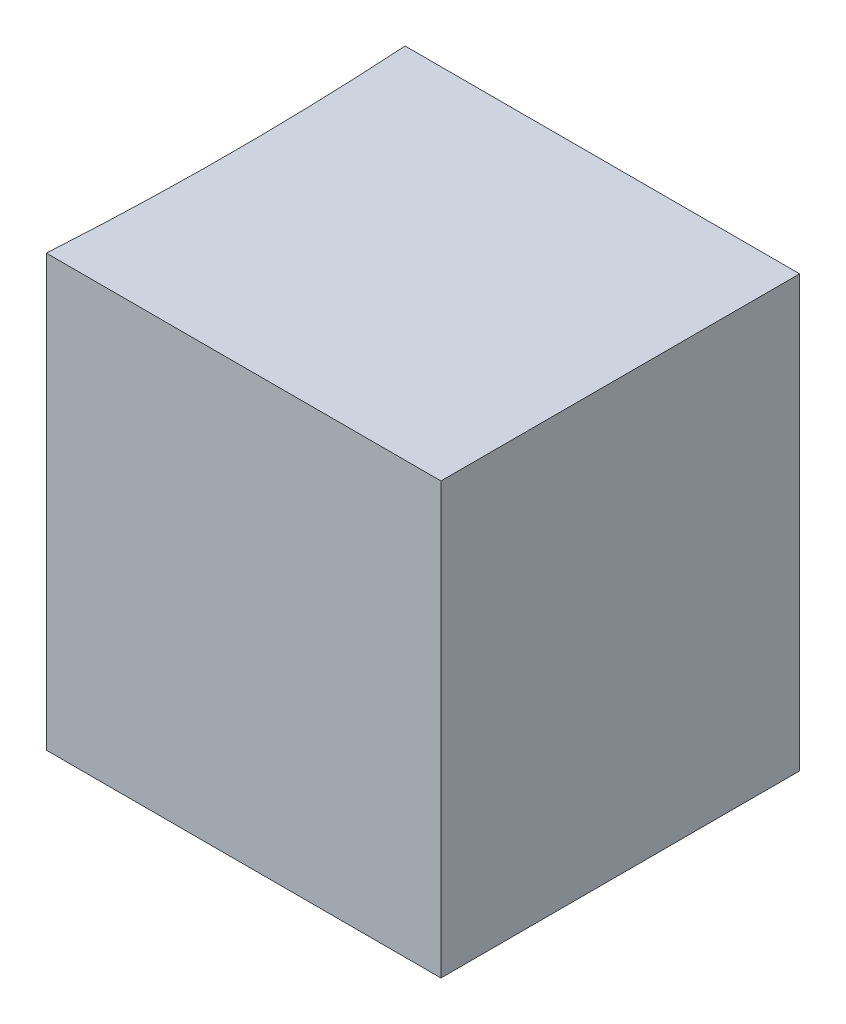
ISO-10303-21;
HEADER;
FILE_DESCRIPTION(('STEP AP214'),'2;1');
FILE_NAME('part.step','',(''),(''),'','','');
FILE_SCHEMA(('AUTOMOTIVE_DESIGN { 1 0 10303 214 1 1 1 1 }'));
ENDSEC;
DATA;
#1=APPLICATION_CONTEXT('core data for automotive mechanical design processes');
#2=APPLICATION_PROTOCOL_DEFINITION('international standard','automotive_design',2000,#1);
#3=PRODUCT_CONTEXT('',#1,'mechanical');
#4=PRODUCT('Part','Part','',(#3));
#5=PRODUCT_RELATED_PRODUCT_CATEGORY('part','',(#4));
#6=PRODUCT_DEFINITION_FORMATION('','',#4);
#7=PRODUCT_DEFINITION_CONTEXT('part definition',#1,'design');
#8=PRODUCT_DEFINITION('design','',#6,#7);
#9=PRODUCT_DEFINITION_SHAPE('','',#8);
#10=(LENGTH_UNIT() NAMED_UNIT(*) SI_UNIT(.MILLI.,.METRE.));
#11=(NAMED_UNIT(*) PLANE_ANGLE_UNIT() SI_UNIT($,.RADIAN.));
#12=(NAMED_UNIT(*) SI_UNIT($,.STERADIAN.) SOLID_ANGLE_UNIT());
#13=UNCERTAINTY_MEASURE_WITH_UNIT(LENGTH_MEASURE(1.E-05),#10,'distance_accuracy_value','');
#14=(GEOMETRIC_REPRESENTATION_CONTEXT(3) GLOBAL_UNCERTAINTY_ASSIGNED_CONTEXT((#13)) GLOBAL_UNIT_ASSIGNED_CONTEXT((#10,
#11,#12)) REPRESENTATION_CONTEXT('',''));
#15=CARTESIAN_POINT('',(0.,0.,0.));
#16=DIRECTION('',(0.,0.,1.));
#17=DIRECTION('',(1.,0.,0.));
#18=AXIS2_PLACEMENT_3D('',#15,#16,#17);
#19=CARTESIAN_POINT('',(0.,15.24,0.));
#20=DIRECTION('',(0.,-1.,0.));
#21=DIRECTION('',(0.,0.,-1.));
#22=AXIS2_PLACEMENT_3D('',#19,#20,#21);
#23=CYLINDRICAL_SURFACE('',#22,101.6);
#24=CARTESIAN_POINT('',(0.,0.,0.));
#25=DIRECTION('',(0.,-1.,0.));
#26=DIRECTION('',(0.,0.,1.));
#27=AXIS2_PLACEMENT_3D('',#24,#25,#26);
#28=CIRCLE('',#27,101.6);
#29=CARTESIAN_POINT('',(101.401368333963,0.,-6.35));
#30=VERTEX_POINT('',#29);
#31=CARTESIAN_POINT('',(101.401368333963,0.,6.35));
#32=VERTEX_POINT('',#31);
#33=EDGE_CURVE('E106',#30,#32,#28,.T.);
#34=ORIENTED_EDGE('',*,*,#33,.T.);
#35=DIRECTION('',(0.,-1.,0.));
#36=VECTOR('',#35,1.);
#37=CARTESIAN_POINT('',(101.401368333963,15.24,6.35));
#38=LINE('',#37,#36);
#39=CARTESIAN_POINT('',(101.401368333963,15.24,6.35));
#40=VERTEX_POINT('',#39);
#41=EDGE_CURVE('E11',#40,#32,#38,.T.);
#42=ORIENTED_EDGE('',*,*,#41,.F.);
#43=CARTESIAN_POINT('',(0.,15.24,0.));
#44=DIRECTION('',(0.,-1.,0.));
#45=DIRECTION('',(0.,0.,1.));
#46=AXIS2_PLACEMENT_3D('',#43,#44,#45);
#47=CIRCLE('',#46,101.6);
#48=CARTESIAN_POINT('',(101.401368333963,15.24,-6.35));
#49=VERTEX_POINT('',#48);
#50=EDGE_CURVE('E93',#49,#40,#47,.T.);
#51=ORIENTED_EDGE('',*,*,#50,.F.);
#52=DIRECTION('',(0.,-1.,0.));
#53=VECTOR('',#52,1.);
#54=CARTESIAN_POINT('',(101.401368333963,15.24,-6.35));
#55=LINE('',#54,#53);
#56=EDGE_CURVE('E102',#49,#30,#55,.T.);
#57=ORIENTED_EDGE('',*,*,#56,.T.);
#58=EDGE_LOOP('',(#34,#42,#51,#57));
#59=FACE_BOUND('',#58,.T.);
#60=ADVANCED_FACE('F43',(#59),#23,.F.);
#61=CARTESIAN_POINT('',(115.371368333963,15.24,6.35));
#62=DIRECTION('',(0.,0.,-1.));
#63=DIRECTION('',(-1.,0.,0.));
#64=AXIS2_PLACEMENT_3D('',#61,#62,#63);
#65=PLANE('',#64);
#66=DIRECTION('',(1.,0.,0.));
#67=VECTOR('',#66,1.);
#68=CARTESIAN_POINT('',(115.371368333963,0.,6.35));
#69=LINE('',#68,#67);
#70=CARTESIAN_POINT('',(115.371368333963,0.,6.35));
#71=VERTEX_POINT('',#70);
#72=EDGE_CURVE('E98',#32,#71,#69,.T.);
#73=ORIENTED_EDGE('',*,*,#72,.T.);
#74=DIRECTION('',(0.,-1.,0.));
#75=VECTOR('',#74,1.);
#76=CARTESIAN_POINT('',(115.371368333963,15.24,6.35));
#77=LINE('',#76,#75);
#78=CARTESIAN_POINT('',(115.371368333963,15.24,6.35));
#79=VERTEX_POINT('',#78);
#80=EDGE_CURVE('E51',#79,#71,#77,.T.);
#81=ORIENTED_EDGE('',*,*,#80,.F.);
#82=DIRECTION('',(1.,0.,0.));
#83=VECTOR('',#82,1.);
#84=CARTESIAN_POINT('',(115.371368333963,15.24,6.35));
#85=LINE('',#84,#83);
#86=EDGE_CURVE('E88',#40,#79,#85,.T.);
#87=ORIENTED_EDGE('',*,*,#86,.F.);
#88=ORIENTED_EDGE('',*,*,#41,.T.);
#89=EDGE_LOOP('',(#73,#81,#87,#88));
#90=FACE_BOUND('',#89,.T.);
#91=ADVANCED_FACE('F97',(#90),#65,.F.);
#92=CARTESIAN_POINT('',(115.371368333963,15.24,3.17500000000013));
#93=DIRECTION('',(-1.,0.,0.));
#94=DIRECTION('',(0.,0.,1.));
#95=AXIS2_PLACEMENT_3D('',#92,#93,#94);
#96=PLANE('',#95);
#97=DIRECTION('',(0.,0.,-1.));
#98=VECTOR('',#97,1.);
#99=CARTESIAN_POINT('',(115.371368333963,0.,3.17500000000013));
#100=LINE('',#99,#98);
#101=CARTESIAN_POINT('',(115.371368333963,0.,-6.35));
#102=VERTEX_POINT('',#101);
#103=EDGE_CURVE('E75',#71,#102,#100,.T.);
#104=ORIENTED_EDGE('',*,*,#103,.T.);
#105=DIRECTION('',(0.,-1.,0.));
#106=VECTOR('',#105,1.);
#107=CARTESIAN_POINT('',(115.371368333963,15.24,-6.35));
#108=LINE('',#107,#106);
#109=CARTESIAN_POINT('',(115.371368333963,15.24,-6.35));
#110=VERTEX_POINT('',#109);
#111=EDGE_CURVE('E99',#110,#102,#108,.T.);
#112=ORIENTED_EDGE('',*,*,#111,.F.);
#113=DIRECTION('',(0.,0.,-1.));
#114=VECTOR('',#113,1.);
#115=CARTESIAN_POINT('',(115.371368333963,15.24,3.17500000000013));
#116=LINE('',#115,#114);
#117=EDGE_CURVE('E91',#79,#110,#116,.T.);
#118=ORIENTED_EDGE('',*,*,#117,.F.);
#119=ORIENTED_EDGE('',*,*,#80,.T.);
#120=EDGE_LOOP('',(#104,#112,#118,#119));
#121=FACE_BOUND('',#120,.T.);
#122=ADVANCED_FACE('F100',(#121),#96,.F.);
#123=CARTESIAN_POINT('',(115.371368333963,15.24,-6.35));
#124=DIRECTION('',(0.,0.,1.));
#125=DIRECTION('',(1.,0.,0.));
#126=AXIS2_PLACEMENT_3D('',#123,#124,#125);
#127=PLANE('',#126);
#128=DIRECTION('',(-1.,0.,0.));
#129=VECTOR('',#128,1.);
#130=CARTESIAN_POINT('',(115.371368333963,0.,-6.35));
#131=LINE('',#130,#129);
#132=EDGE_CURVE('E81',#102,#30,#131,.T.);
#133=ORIENTED_EDGE('',*,*,#132,.T.);
#134=ORIENTED_EDGE('',*,*,#56,.F.);
#135=DIRECTION('',(-1.,0.,0.));
#136=VECTOR('',#135,1.);
#137=CARTESIAN_POINT('',(115.371368333963,15.24,-6.35));
#138=LINE('',#137,#136);
#139=EDGE_CURVE('E59',#110,#49,#138,.T.);
#140=ORIENTED_EDGE('',*,*,#139,.F.);
#141=ORIENTED_EDGE('',*,*,#111,.T.);
#142=EDGE_LOOP('',(#133,#134,#140,#141));
#143=FACE_BOUND('',#142,.T.);
#144=ADVANCED_FACE('F113',(#143),#127,.F.);
#145=CARTESIAN_POINT('',(0.,15.24,0.));
#146=DIRECTION('',(0.,1.,0.));
#147=DIRECTION('',(0.,0.,1.));
#148=AXIS2_PLACEMENT_3D('',#145,#146,#147);
#149=PLANE('',#148);
#150=ORIENTED_EDGE('',*,*,#50,.T.);
#151=ORIENTED_EDGE('',*,*,#86,.T.);
#152=ORIENTED_EDGE('',*,*,#117,.T.);
#153=ORIENTED_EDGE('',*,*,#139,.T.);
#154=EDGE_LOOP('',(#150,#151,#152,#153));
#155=FACE_BOUND('',#154,.T.);
#156=ADVANCED_FACE('F89',(#155),#149,.T.);
#157=CARTESIAN_POINT('',(0.,0.,0.));
#158=DIRECTION('',(0.,1.,0.));
#159=DIRECTION('',(0.,0.,1.));
#160=AXIS2_PLACEMENT_3D('',#157,#158,#159);
#161=PLANE('',#160);
#162=ORIENTED_EDGE('',*,*,#33,.F.);
#163=ORIENTED_EDGE('',*,*,#132,.F.);
#164=ORIENTED_EDGE('',*,*,#103,.F.);
#165=ORIENTED_EDGE('',*,*,#72,.F.);
#166=EDGE_LOOP('',(#162,#163,#164,#165));
#167=FACE_BOUND('',#166,.T.);
#168=ADVANCED_FACE('F116',(#167),#161,.F.);
#169=CLOSED_SHELL('',(#60,#91,#122,#144,#156,#168));
#170=MANIFOLD_SOLID_BREP('B2',#169);
#171=ADVANCED_BREP_SHAPE_REPRESENTATION('',(#18,#170),#14);
#172=SHAPE_DEFINITION_REPRESENTATION(#9,#171);
ENDSEC;
END-ISO-10303-21;
